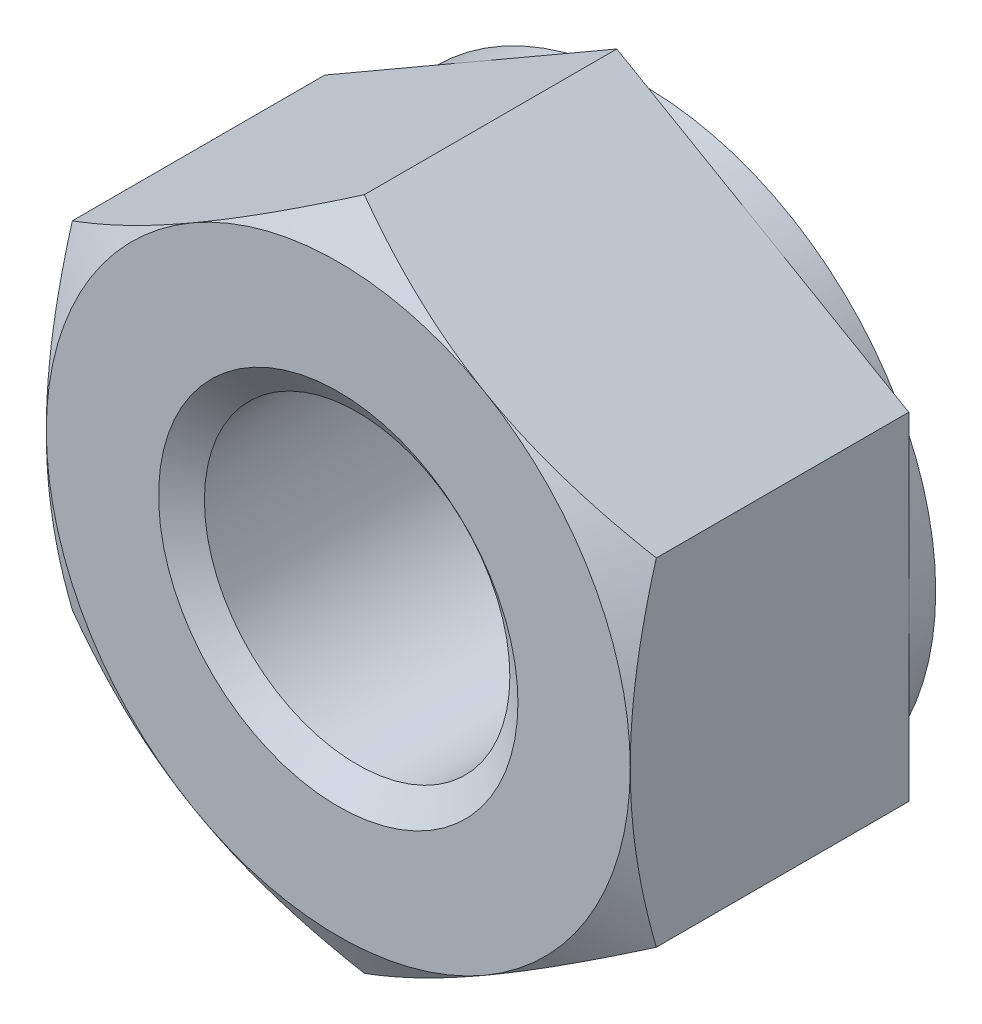
ISO-10303-21;
HEADER;
FILE_DESCRIPTION(('STEP AP214'),'2;1');
FILE_NAME('part.step','',(''),(''),'','','');
FILE_SCHEMA(('AUTOMOTIVE_DESIGN { 1 0 10303 214 1 1 1 1 }'));
ENDSEC;
DATA;
#1=APPLICATION_CONTEXT('core data for automotive mechanical design processes');
#2=APPLICATION_PROTOCOL_DEFINITION('international standard','automotive_design',2000,#1);
#3=PRODUCT_CONTEXT('',#1,'mechanical');
#4=PRODUCT('Part','Part','',(#3));
#5=PRODUCT_RELATED_PRODUCT_CATEGORY('part','',(#4));
#6=PRODUCT_DEFINITION_FORMATION('','',#4);
#7=PRODUCT_DEFINITION_CONTEXT('part definition',#1,'design');
#8=PRODUCT_DEFINITION('design','',#6,#7);
#9=PRODUCT_DEFINITION_SHAPE('','',#8);
#10=(LENGTH_UNIT() NAMED_UNIT(*) SI_UNIT(.MILLI.,.METRE.));
#11=(NAMED_UNIT(*) PLANE_ANGLE_UNIT() SI_UNIT($,.RADIAN.));
#12=(NAMED_UNIT(*) SI_UNIT($,.STERADIAN.) SOLID_ANGLE_UNIT());
#13=UNCERTAINTY_MEASURE_WITH_UNIT(LENGTH_MEASURE(1.E-05),#10,'distance_accuracy_value','');
#14=(GEOMETRIC_REPRESENTATION_CONTEXT(3) GLOBAL_UNCERTAINTY_ASSIGNED_CONTEXT((#13)) GLOBAL_UNIT_ASSIGNED_CONTEXT((#10,
#11,#12)) REPRESENTATION_CONTEXT('',''));
#15=CARTESIAN_POINT('',(0.,0.,0.));
#16=DIRECTION('',(0.,0.,1.));
#17=DIRECTION('',(1.,0.,0.));
#18=AXIS2_PLACEMENT_3D('',#15,#16,#17);
#19=CARTESIAN_POINT('',(0.,0.,-6.8));
#20=DIRECTION('',(0.,0.,1.));
#21=DIRECTION('',(1.,0.,0.));
#22=AXIS2_PLACEMENT_3D('',#19,#20,#21);
#23=CYLINDRICAL_SURFACE('',#22,3.4);
#24=CARTESIAN_POINT('',(0.,0.,-0.420124522925826));
#25=DIRECTION('',(0.,0.,1.));
#26=DIRECTION('',(1.,0.,0.));
#27=AXIS2_PLACEMENT_3D('',#24,#25,#26);
#28=CIRCLE('',#27,3.4);
#29=CARTESIAN_POINT('',(3.4,0.,-0.420124522925826));
#30=VERTEX_POINT('',#29);
#31=EDGE_CURVE('E158',#30,#30,#28,.F.);
#32=ORIENTED_EDGE('',*,*,#31,.F.);
#33=EDGE_LOOP('',(#32));
#34=FACE_BOUND('',#33,.T.);
#35=CARTESIAN_POINT('',(0.,0.,-6.35447547707417));
#36=DIRECTION('',(0.,0.,-1.));
#37=DIRECTION('',(-1.,0.,0.));
#38=AXIS2_PLACEMENT_3D('',#35,#36,#37);
#39=CIRCLE('',#38,3.4);
#40=CARTESIAN_POINT('',(-3.4,0.,-6.35447547707417));
#41=VERTEX_POINT('',#40);
#42=EDGE_CURVE('E46',#41,#41,#39,.F.);
#43=ORIENTED_EDGE('',*,*,#42,.F.);
#44=EDGE_LOOP('',(#43));
#45=FACE_BOUND('',#44,.T.);
#46=ADVANCED_FACE('F41',(#34,#45),#23,.F.);
#47=CARTESIAN_POINT('',(0.,7.50555349946514,-6.8));
#48=DIRECTION('',(-0.500000000000002,0.866025403784438,0.));
#49=DIRECTION('',(-0.866025403784438,-0.500000000000002,0.));
#50=AXIS2_PLACEMENT_3D('',#47,#48,#49);
#51=PLANE('',#50);
#52=DIRECTION('',(0.,0.,1.));
#53=VECTOR('',#52,1.);
#54=CARTESIAN_POINT('',(-6.5,3.75277674973256,-6.8));
#55=LINE('',#54,#53);
#56=CARTESIAN_POINT('',(-6.5,3.75277674973256,-6.2));
#57=VERTEX_POINT('',#56);
#58=CARTESIAN_POINT('',(-6.5,3.75277674973256,-0.580556583600771));
#59=VERTEX_POINT('',#58);
#60=EDGE_CURVE('E296',#57,#59,#55,.T.);
#61=ORIENTED_EDGE('',*,*,#60,.T.);
#62=CARTESIAN_POINT('',(-6.5002,3.75266127967872,-0.58062325180587));
#63=CARTESIAN_POINT('',(-6.35732254094112,3.8351516191275,-0.533004423075488));
#64=CARTESIAN_POINT('',(-6.21391236546509,3.91794952254312,-0.487546700602708));
#65=CARTESIAN_POINT('',(-5.9259273686828,4.08421773795794,-0.401548682023047));
#66=CARTESIAN_POINT('',(-5.78135207342874,4.16768832359105,-0.361010507228026));
#67=CARTESIAN_POINT('',(-5.34531134947997,4.41943655294051,-0.247571001123208));
#68=CARTESIAN_POINT('',(-5.05212471715368,4.58870793403689,-0.183047807128738));
#69=CARTESIAN_POINT('',(-4.61337625445563,4.84201947708215,-0.10738658354749));
#70=CARTESIAN_POINT('',(-4.46912536350531,4.92530276780316,-0.0858328564569865));
#71=CARTESIAN_POINT('',(-4.17997178286191,5.09224566542477,-0.049690314606118));
#72=CARTESIAN_POINT('',(-4.03506915190111,5.17590523841627,-0.0351008844596655));
#73=CARTESIAN_POINT('',(-3.74501222057168,5.34336968579964,-0.0132587525073459));
#74=CARTESIAN_POINT('',(-3.59985839394579,5.427174286676,-0.00599772432210719));
#75=CARTESIAN_POINT('',(-3.30942466302505,5.59485627940483,0.00103969741776889));
#76=CARTESIAN_POINT('',(-3.16414476276364,5.6787336689286,0.000816322187795537));
#77=CARTESIAN_POINT('',(-2.76612405757351,5.90853103021317,-0.0100834585151655));
#78=CARTESIAN_POINT('',(-2.51351353897243,6.05437578112764,-0.028381817869414));
#79=CARTESIAN_POINT('',(-2.00997032176432,6.34509659313135,-0.0864063414576771));
#80=CARTESIAN_POINT('',(-1.75903939406692,6.48997163178545,-0.126152338538247));
#81=CARTESIAN_POINT('',(-1.25448277935568,6.78127752911039,-0.225505903202153));
#82=CARTESIAN_POINT('',(-1.00092075856409,6.92767163007068,-0.285534425638031));
#83=CARTESIAN_POINT('',(-0.497578064240956,7.21827667013277,-0.421774992509875));
#84=CARTESIAN_POINT('',(-0.247790944447037,7.36249133098589,-0.497955034163601));
#85=CARTESIAN_POINT('',(0.000199999999999077,7.50566896951898,-0.580623251805876));
#86=B_SPLINE_CURVE_WITH_KNOTS('',3,(#62,#63,#64,#65,#66,#67,#68,#69,#70,#71,#72,#73,#74,#75,#76,
#77,#78,#79,#80,#81,#82,#83,#84,#85),.UNSPECIFIED.,.F.,.F.,(4,2,2,2,2,2,2,2,2,2,2,4),(0.,
0.515105052395588,1.03043143507525,2.06322554824263,2.56697389547997,3.07067772176454,
3.57380860368928,4.0769239424252,4.95279354705661,5.82947446853467,6.72559912449737,
7.61996451221047),.UNSPECIFIED.);
#87=CARTESIAN_POINT('',(-3.25000000000001,5.62916512459885,0.));
#88=VERTEX_POINT('',#87);
#89=EDGE_CURVE('E144',#59,#88,#86,.T.);
#90=ORIENTED_EDGE('',*,*,#89,.T.);
#91=CARTESIAN_POINT('',(0.,7.50555349946514,-0.580556583600771));
#92=VERTEX_POINT('',#91);
#93=EDGE_CURVE('E171',#88,#92,#86,.T.);
#94=ORIENTED_EDGE('',*,*,#93,.T.);
#95=DIRECTION('',(0.,0.,1.));
#96=VECTOR('',#95,1.);
#97=CARTESIAN_POINT('',(0.,7.50555349946514,-6.8));
#98=LINE('',#97,#96);
#99=CARTESIAN_POINT('',(0.,7.50555349946514,-6.2));
#100=VERTEX_POINT('',#99);
#101=EDGE_CURVE('E284',#100,#92,#98,.T.);
#102=ORIENTED_EDGE('',*,*,#101,.F.);
#103=DIRECTION('',(-0.866025403784438,-0.500000000000002,0.));
#104=VECTOR('',#103,1.);
#105=CARTESIAN_POINT('',(0.,7.50555349946514,-6.2));
#106=LINE('',#105,#104);
#107=CARTESIAN_POINT('',(-3.25000000000001,5.62916512459885,-6.2));
#108=VERTEX_POINT('',#107);
#109=EDGE_CURVE('E272',#100,#108,#106,.T.);
#110=ORIENTED_EDGE('',*,*,#109,.T.);
#111=EDGE_CURVE('E268',#108,#57,#106,.T.);
#112=ORIENTED_EDGE('',*,*,#111,.T.);
#113=EDGE_LOOP('',(#61,#90,#94,#102,#110,#112));
#114=FACE_BOUND('',#113,.T.);
#115=ADVANCED_FACE('F43',(#114),#51,.T.);
#116=CARTESIAN_POINT('',(6.5,3.75277674973256,-6.8));
#117=DIRECTION('',(0.500000000000001,0.866025403784438,0.));
#118=DIRECTION('',(-0.866025403784438,0.500000000000001,0.));
#119=AXIS2_PLACEMENT_3D('',#116,#117,#118);
#120=PLANE('',#119);
#121=ORIENTED_EDGE('',*,*,#101,.T.);
#122=CARTESIAN_POINT('',(-0.000200000000000769,7.50566896951898,-0.580623251805876));
#123=CARTESIAN_POINT('',(0.14267745905888,7.4231786300702,-0.533004423075494));
#124=CARTESIAN_POINT('',(0.286087634534912,7.34038072665459,-0.487546700602714));
#125=CARTESIAN_POINT('',(0.574072631317195,7.17411251123976,-0.401548682023053));
#126=CARTESIAN_POINT('',(0.718647926571264,7.09064192560666,-0.361010507228032));
#127=CARTESIAN_POINT('',(1.15468865052003,6.83889369625719,-0.247571001123213));
#128=CARTESIAN_POINT('',(1.44787528284632,6.66962231516081,-0.183047807128742));
#129=CARTESIAN_POINT('',(1.88662374554438,6.41631077211555,-0.107386583547494));
#130=CARTESIAN_POINT('',(2.03087463649469,6.33302748139454,-0.0858328564569894));
#131=CARTESIAN_POINT('',(2.32002821713809,6.16608458377293,-0.0496903146061202));
#132=CARTESIAN_POINT('',(2.46493084809889,6.08242501078143,-0.0351008844596673));
#133=CARTESIAN_POINT('',(2.75498777942832,5.91496056339806,-0.0132587525073472));
#134=CARTESIAN_POINT('',(2.90014160605421,5.8311559625217,-0.00599772432210828));
#135=CARTESIAN_POINT('',(3.19057533697495,5.66347396979287,0.00103969741776823));
#136=CARTESIAN_POINT('',(3.33585523723636,5.5795965802691,0.000816322187795168));
#137=CARTESIAN_POINT('',(3.7338759424265,5.34979921898453,-0.0100834585151652));
#138=CARTESIAN_POINT('',(3.98648646102757,5.20395446807007,-0.0283818178694134));
#139=CARTESIAN_POINT('',(4.49002967823568,4.91323365606635,-0.0864063414576753));
#140=CARTESIAN_POINT('',(4.74096060593308,4.76835861741225,-0.126152338538245));
#141=CARTESIAN_POINT('',(5.24551722064432,4.47705272008731,-0.22550590320215));
#142=CARTESIAN_POINT('',(5.49907924143591,4.33065861912702,-0.285534425638027));
#143=CARTESIAN_POINT('',(6.00242193575904,4.04005357906493,-0.42177499250987));
#144=CARTESIAN_POINT('',(6.25220905555296,3.89583891821181,-0.497955034163595));
#145=CARTESIAN_POINT('',(6.5002,3.75266127967872,-0.58062325180587));
#146=B_SPLINE_CURVE_WITH_KNOTS('',3,(#122,#123,#124,#125,#126,#127,#128,#129,#130,#131,#132,
#133,#134,#135,#136,#137,#138,#139,#140,#141,#142,#143,#144,#145),.UNSPECIFIED.,.F.,.F.,(4,2,2,
2,2,2,2,2,2,2,2,4),(0.,0.515105052395589,1.03043143507525,2.06322554824263,2.56697389547997,
3.07067772176454,3.57380860368929,4.07692394242521,4.95279354705661,5.82947446853467,
6.72559912449737,7.61996451221046),.UNSPECIFIED.);
#147=CARTESIAN_POINT('',(3.25000000000001,5.62916512459885,0.));
#148=VERTEX_POINT('',#147);
#149=EDGE_CURVE('E167',#92,#148,#146,.T.);
#150=ORIENTED_EDGE('',*,*,#149,.T.);
#151=CARTESIAN_POINT('',(6.5,3.75277674973258,-0.580556583600771));
#152=VERTEX_POINT('',#151);
#153=EDGE_CURVE('E153',#148,#152,#146,.T.);
#154=ORIENTED_EDGE('',*,*,#153,.T.);
#155=DIRECTION('',(0.,0.,1.));
#156=VECTOR('',#155,1.);
#157=CARTESIAN_POINT('',(6.5,3.75277674973256,-6.8));
#158=LINE('',#157,#156);
#159=CARTESIAN_POINT('',(6.5,3.75277674973256,-6.2));
#160=VERTEX_POINT('',#159);
#161=EDGE_CURVE('E166',#160,#152,#158,.T.);
#162=ORIENTED_EDGE('',*,*,#161,.F.);
#163=DIRECTION('',(-0.866025403784438,0.500000000000001,0.));
#164=VECTOR('',#163,1.);
#165=CARTESIAN_POINT('',(6.5,3.75277674973256,-6.2));
#166=LINE('',#165,#164);
#167=CARTESIAN_POINT('',(3.25000000000001,5.62916512459885,-6.2));
#168=VERTEX_POINT('',#167);
#169=EDGE_CURVE('E280',#160,#168,#166,.T.);
#170=ORIENTED_EDGE('',*,*,#169,.T.);
#171=EDGE_CURVE('E276',#168,#100,#166,.T.);
#172=ORIENTED_EDGE('',*,*,#171,.T.);
#173=EDGE_LOOP('',(#121,#150,#154,#162,#170,#172));
#174=FACE_BOUND('',#173,.T.);
#175=ADVANCED_FACE('F243',(#174),#120,.T.);
#176=CARTESIAN_POINT('',(6.5,3.75277674973256,-6.8));
#177=DIRECTION('',(-1.,0.,0.));
#178=DIRECTION('',(0.,0.,1.));
#179=AXIS2_PLACEMENT_3D('',#176,#177,#178);
#180=PLANE('',#179);
#181=CARTESIAN_POINT('',(6.5,-9.95291698368313,-3.11042358451599));
#182=CARTESIAN_POINT('',(6.5,-9.66753022820206,-2.97250893962365));
#183=CARTESIAN_POINT('',(6.5,-9.38146872221018,-2.8359652810007));
#184=CARTESIAN_POINT('',(6.5,-8.80763137697965,-2.56640336373165));
#185=CARTESIAN_POINT('',(6.5,-8.5198552513496,-2.43338571546935));
#186=CARTESIAN_POINT('',(6.5,-7.94066929123456,-2.17095850209535));
#187=CARTESIAN_POINT('',(6.5,-7.64924808662455,-2.04157394066247));
#188=CARTESIAN_POINT('',(6.5,-7.06401043497073,-1.78836220262284));
#189=CARTESIAN_POINT('',(6.5,-6.77019411372555,-1.66453473633514));
#190=CARTESIAN_POINT('',(6.5,-6.17605150217578,-1.42244480194622));
#191=CARTESIAN_POINT('',(6.5,-5.87568957429354,-1.30426931829828));
#192=CARTESIAN_POINT('',(6.5,-5.27142269448723,-1.07717389386354));
#193=CARTESIAN_POINT('',(6.5,-4.9675173526422,-0.968254982821991));
#194=CARTESIAN_POINT('',(6.5,-4.35630541725461,-0.762599022073944));
#195=CARTESIAN_POINT('',(6.5,-4.04900762614674,-0.665836073792646));
#196=CARTESIAN_POINT('',(6.5,-3.43004022230997,-0.487635712034288));
#197=CARTESIAN_POINT('',(6.5,-3.11837202573309,-0.406193452076782));
#198=CARTESIAN_POINT('',(6.5,-2.49046594828965,-0.26258408019258));
#199=CARTESIAN_POINT('',(6.5,-2.17422687409775,-0.200422100523436));
#200=CARTESIAN_POINT('',(6.5,-1.5378916759482,-0.0995742225329257));
#201=CARTESIAN_POINT('',(6.5,-1.2177955485807,-0.0608883449673841));
#202=CARTESIAN_POINT('',(6.5,-0.737141963129278,-0.0229465620569957));
#203=CARTESIAN_POINT('',(6.5,-0.57733688697972,-0.0136452147630797));
#204=CARTESIAN_POINT('',(6.5,-0.257468906786595,-0.00181408796460789));
#205=CARTESIAN_POINT('',(6.5,-0.0974060061182582,0.000715779477276867));
#206=CARTESIAN_POINT('',(6.5,0.222635442153785,-0.00106401163083596));
#207=CARTESIAN_POINT('',(6.5,0.382614000823772,-0.00537175068700523));
#208=CARTESIAN_POINT('',(6.5,0.702250634961164,-0.020717582519642));
#209=CARTESIAN_POINT('',(6.5,0.861908694024545,-0.0317560114013201));
#210=CARTESIAN_POINT('',(6.5,1.24887053403167,-0.0664368683339286));
#211=CARTESIAN_POINT('',(6.5,1.47587694728923,-0.093451878593183));
#212=CARTESIAN_POINT('',(6.5,1.92815030612898,-0.15958988800503));
#213=CARTESIAN_POINT('',(6.5,2.15341675970355,-0.198716192016403));
#214=CARTESIAN_POINT('',(6.5,2.6020242784339,-0.287689170365798));
#215=CARTESIAN_POINT('',(6.5,2.82536331401075,-0.337545980881486));
#216=CARTESIAN_POINT('',(6.5,3.26974354822384,-0.446458764113079));
#217=CARTESIAN_POINT('',(6.5,3.49078496123694,-0.505513870223688));
#218=CARTESIAN_POINT('',(6.5,3.93601414582635,-0.632954116493084));
#219=CARTESIAN_POINT('',(6.5,4.1601462295919,-0.701532472923335));
#220=CARTESIAN_POINT('',(6.5,4.60604131565917,-0.845465123541097));
#221=CARTESIAN_POINT('',(6.5,4.82780583559526,-0.920814744092753));
#222=CARTESIAN_POINT('',(6.5,5.26807593346454,-1.07673350293345));
#223=CARTESIAN_POINT('',(6.5,5.4865928289811,-1.15727087504746));
#224=CARTESIAN_POINT('',(6.5,5.92193123194619,-1.32307270438627));
#225=CARTESIAN_POINT('',(6.5,6.13875201319725,-1.40833907213759));
#226=CARTESIAN_POINT('',(6.5,6.35478510853348,-1.49550213563036));
#227=B_SPLINE_CURVE_WITH_KNOTS('',3,(#181,#182,#183,#184,#185,#186,#187,#188,#189,#190,#191,
#192,#193,#194,#195,#196,#197,#198,#199,#200,#201,#202,#203,#204,#205,#206,#207,#208,#209,#210,
#211,#212,#213,#214,#215,#216,#217,#218,#219,#220,#221,#222,#223,#224,#225,#226),.UNSPECIFIED.,
.F.,.F.,(4,2,2,2,2,2,2,2,2,2,2,2,2,2,2,2,2,2,2,2,2,2,4),(0.,0.950904162864941,1.90197187472378,
2.85848216299727,3.81494253212838,4.78314526620908,5.75145556717361,6.71766655133576,
7.68357137261129,8.64973308985235,9.61589566130056,10.0960003863608,10.5760988765458,
11.0560626144432,11.5360503218788,12.2214931749033,12.9071232326805,13.5934038106301,
14.2796197706252,14.9826563668411,15.6852113891479,16.3838119598016,17.082696852468),.UNSPECIFIED.);
#228=CARTESIAN_POINT('',(6.5,-3.75277674973258,-0.580556583600771));
#229=VERTEX_POINT('',#228);
#230=CARTESIAN_POINT('',(6.5,0.,0.));
#231=VERTEX_POINT('',#230);
#232=EDGE_CURVE('E133',#229,#231,#227,.T.);
#233=ORIENTED_EDGE('',*,*,#232,.F.);
#234=DIRECTION('',(0.,0.,1.));
#235=VECTOR('',#234,1.);
#236=CARTESIAN_POINT('',(6.5,-3.75277674973258,-6.8));
#237=LINE('',#236,#235);
#238=CARTESIAN_POINT('',(6.5,-3.75277674973258,-6.2));
#239=VERTEX_POINT('',#238);
#240=EDGE_CURVE('E289',#239,#229,#237,.T.);
#241=ORIENTED_EDGE('',*,*,#240,.F.);
#242=DIRECTION('',(0.,-1.,0.));
#243=VECTOR('',#242,1.);
#244=CARTESIAN_POINT('',(6.5,3.75277674973256,-6.2));
#245=LINE('',#244,#243);
#246=CARTESIAN_POINT('',(6.5,0.,-6.2));
#247=VERTEX_POINT('',#246);
#248=EDGE_CURVE('E281',#247,#239,#245,.T.);
#249=ORIENTED_EDGE('',*,*,#248,.F.);
#250=EDGE_CURVE('E283',#160,#247,#245,.T.);
#251=ORIENTED_EDGE('',*,*,#250,.F.);
#252=ORIENTED_EDGE('',*,*,#161,.T.);
#253=EDGE_CURVE('E146',#231,#152,#227,.T.);
#254=ORIENTED_EDGE('',*,*,#253,.F.);
#255=EDGE_LOOP('',(#233,#241,#249,#251,#252,#254));
#256=FACE_BOUND('',#255,.T.);
#257=ADVANCED_FACE('F163',(#256),#180,.F.);
#258=CARTESIAN_POINT('',(0.,-7.50555349946516,-6.8));
#259=DIRECTION('',(0.500000000000002,-0.866025403784437,0.));
#260=DIRECTION('',(0.866025403784438,0.500000000000002,0.));
#261=AXIS2_PLACEMENT_3D('',#258,#259,#260);
#262=PLANE('',#261);
#263=ORIENTED_EDGE('',*,*,#240,.T.);
#264=CARTESIAN_POINT('',(6.5002,-3.75266127967874,-0.580623251805876));
#265=CARTESIAN_POINT('',(6.35732254094112,-3.83515161912752,-0.533004423075494));
#266=CARTESIAN_POINT('',(6.21391236546509,-3.91794952254314,-0.487546700602714));
#267=CARTESIAN_POINT('',(5.9259273686828,-4.08421773795796,-0.401548682023053));
#268=CARTESIAN_POINT('',(5.78135207342874,-4.16768832359107,-0.361010507228032));
#269=CARTESIAN_POINT('',(5.34531134947996,-4.41943655294053,-0.247571001123215));
#270=CARTESIAN_POINT('',(5.05212471715368,-4.58870793403691,-0.183047807128746));
#271=CARTESIAN_POINT('',(4.61337625445562,-4.84201947708217,-0.107386583547499));
#272=CARTESIAN_POINT('',(4.46912536350531,-4.92530276780318,-0.0858328564569949));
#273=CARTESIAN_POINT('',(4.17997178286191,-5.09224566542479,-0.0496903146061268));
#274=CARTESIAN_POINT('',(4.03506915190111,-5.17590523841629,-0.0351008844596745));
#275=CARTESIAN_POINT('',(3.74501222057168,-5.34336968579966,-0.0132587525073552));
#276=CARTESIAN_POINT('',(3.59985839394579,-5.42717428667602,-0.00599772432211649));
#277=CARTESIAN_POINT('',(3.30942466302505,-5.59485627940486,0.00103969741775916));
#278=CARTESIAN_POINT('',(3.16414476276364,-5.67873366892862,0.00081632218778539));
#279=CARTESIAN_POINT('',(2.7661240575735,-5.9085310302132,-0.0100834585151767));
#280=CARTESIAN_POINT('',(2.51351353897243,-6.05437578112766,-0.0283818178694256));
#281=CARTESIAN_POINT('',(2.00997032176432,-6.34509659313137,-0.0864063414576891));
#282=CARTESIAN_POINT('',(1.75903939406691,-6.48997163178547,-0.126152338538259));
#283=CARTESIAN_POINT('',(1.25448277935568,-6.78127752911041,-0.225505903202166));
#284=CARTESIAN_POINT('',(1.00092075856408,-6.9276716300707,-0.285534425638044));
#285=CARTESIAN_POINT('',(0.497578064240955,-7.21827667013279,-0.421774992509888));
#286=CARTESIAN_POINT('',(0.247790944447037,-7.36249133098592,-0.497955034163613));
#287=CARTESIAN_POINT('',(-0.000199999999998837,-7.505668969519,-0.580623251805888));
#288=B_SPLINE_CURVE_WITH_KNOTS('',3,(#264,#265,#266,#267,#268,#269,#270,#271,#272,#273,#274,
#275,#276,#277,#278,#279,#280,#281,#282,#283,#284,#285,#286,#287),.UNSPECIFIED.,.F.,.F.,(4,2,2,
2,2,2,2,2,2,2,2,4),(0.,0.515105052395588,1.03043143507525,2.06322554824263,2.56697389547997,
3.07067772176454,3.57380860368929,4.07692394242521,4.95279354705661,5.82947446853467,
6.72559912449737,7.61996451221047),.UNSPECIFIED.);
#289=CARTESIAN_POINT('',(3.25000000000001,-5.62916512459885,0.));
#290=VERTEX_POINT('',#289);
#291=EDGE_CURVE('E139',#229,#290,#288,.T.);
#292=ORIENTED_EDGE('',*,*,#291,.T.);
#293=CARTESIAN_POINT('',(0.,-7.50555349946514,-0.580556583600771));
#294=VERTEX_POINT('',#293);
#295=EDGE_CURVE('E60',#290,#294,#288,.T.);
#296=ORIENTED_EDGE('',*,*,#295,.T.);
#297=DIRECTION('',(0.,0.,1.));
#298=VECTOR('',#297,1.);
#299=CARTESIAN_POINT('',(0.,-7.50555349946516,-6.8));
#300=LINE('',#299,#298);
#301=CARTESIAN_POINT('',(0.,-7.50555349946516,-6.2));
#302=VERTEX_POINT('',#301);
#303=EDGE_CURVE('E291',#302,#294,#300,.T.);
#304=ORIENTED_EDGE('',*,*,#303,.F.);
#305=DIRECTION('',(0.866025403784438,0.500000000000002,0.));
#306=VECTOR('',#305,1.);
#307=CARTESIAN_POINT('',(0.,-7.50555349946516,-6.2));
#308=LINE('',#307,#306);
#309=CARTESIAN_POINT('',(3.25000000000002,-5.62916512459886,-6.2));
#310=VERTEX_POINT('',#309);
#311=EDGE_CURVE('E273',#302,#310,#308,.T.);
#312=ORIENTED_EDGE('',*,*,#311,.T.);
#313=EDGE_CURVE('E277',#310,#239,#308,.T.);
#314=ORIENTED_EDGE('',*,*,#313,.T.);
#315=EDGE_LOOP('',(#263,#292,#296,#304,#312,#314));
#316=FACE_BOUND('',#315,.T.);
#317=ADVANCED_FACE('F224',(#316),#262,.T.);
#318=CARTESIAN_POINT('',(-6.5,-3.75277674973258,-6.8));
#319=DIRECTION('',(-0.500000000000001,-0.866025403784438,0.));
#320=DIRECTION('',(0.866025403784438,-0.500000000000001,0.));
#321=AXIS2_PLACEMENT_3D('',#318,#319,#320);
#322=PLANE('',#321);
#323=ORIENTED_EDGE('',*,*,#303,.T.);
#324=CARTESIAN_POINT('',(0.000200000000000905,-7.505668969519,-0.580623251805889));
#325=CARTESIAN_POINT('',(-0.14267745905888,-7.42317863007023,-0.533004423075506));
#326=CARTESIAN_POINT('',(-0.286087634534914,-7.34038072665461,-0.487546700602727));
#327=CARTESIAN_POINT('',(-0.574072631317197,-7.17411251123978,-0.401548682023064));
#328=CARTESIAN_POINT('',(-0.718647926571266,-7.09064192560667,-0.361010507228043));
#329=CARTESIAN_POINT('',(-1.15468865052004,-6.83889369625721,-0.247571001123224));
#330=CARTESIAN_POINT('',(-1.44787528284632,-6.66962231516083,-0.183047807128753));
#331=CARTESIAN_POINT('',(-1.88662374554438,-6.41631077211557,-0.107386583547504));
#332=CARTESIAN_POINT('',(-2.0308746364947,-6.33302748139456,-0.0858328564569998));
#333=CARTESIAN_POINT('',(-2.3200282171381,-6.16608458377295,-0.0496903146061308));
#334=CARTESIAN_POINT('',(-2.4649308480989,-6.08242501078145,-0.0351008844596783));
#335=CARTESIAN_POINT('',(-2.75498777942833,-5.91496056339808,-0.0132587525073582));
#336=CARTESIAN_POINT('',(-2.90014160605422,-5.83115596252172,-0.00599772432211898));
#337=CARTESIAN_POINT('',(-3.19057533697496,-5.66347396979288,0.00103969741775764));
#338=CARTESIAN_POINT('',(-3.33585523723637,-5.57959658026912,0.000816322187784388));
#339=CARTESIAN_POINT('',(-3.73387594242651,-5.34979921898455,-0.0100834585151759));
#340=CARTESIAN_POINT('',(-3.98648646102758,-5.20395446807008,-0.0283818178694233));
#341=CARTESIAN_POINT('',(-4.49002967823569,-4.91323365606637,-0.0864063414576845));
#342=CARTESIAN_POINT('',(-4.74096060593309,-4.76835861741227,-0.126152338538254));
#343=CARTESIAN_POINT('',(-5.24551722064433,-4.47705272008733,-0.225505903202159));
#344=CARTESIAN_POINT('',(-5.49907924143592,-4.33065861912704,-0.285534425638036));
#345=CARTESIAN_POINT('',(-6.00242193575905,-4.04005357906495,-0.421774992509877));
#346=CARTESIAN_POINT('',(-6.25220905555296,-3.89583891821183,-0.497955034163602));
#347=CARTESIAN_POINT('',(-6.5002,-3.75266127967875,-0.580623251805876));
#348=B_SPLINE_CURVE_WITH_KNOTS('',3,(#324,#325,#326,#327,#328,#329,#330,#331,#332,#333,#334,
#335,#336,#337,#338,#339,#340,#341,#342,#343,#344,#345,#346,#347),.UNSPECIFIED.,.F.,.F.,(4,2,2,
2,2,2,2,2,2,2,2,4),(0.,0.515105052395591,1.03043143507525,2.06322554824263,2.56697389547998,
3.07067772176455,3.5738086036893,4.07692394242522,4.95279354705662,5.82947446853468,
6.72559912449737,7.61996451221046),.UNSPECIFIED.);
#349=CARTESIAN_POINT('',(-3.25000000000001,-5.62916512459885,0.));
#350=VERTEX_POINT('',#349);
#351=EDGE_CURVE('E218',#294,#350,#348,.T.);
#352=ORIENTED_EDGE('',*,*,#351,.T.);
#353=CARTESIAN_POINT('',(-6.5,-3.75277674973258,-0.580556583600771));
#354=VERTEX_POINT('',#353);
#355=EDGE_CURVE('E67',#350,#354,#348,.T.);
#356=ORIENTED_EDGE('',*,*,#355,.T.);
#357=DIRECTION('',(0.,0.,1.));
#358=VECTOR('',#357,1.);
#359=CARTESIAN_POINT('',(-6.5,-3.75277674973258,-6.8));
#360=LINE('',#359,#358);
#361=CARTESIAN_POINT('',(-6.5,-3.75277674973258,-6.2));
#362=VERTEX_POINT('',#361);
#363=EDGE_CURVE('E294',#362,#354,#360,.T.);
#364=ORIENTED_EDGE('',*,*,#363,.F.);
#365=DIRECTION('',(0.866025403784438,-0.500000000000001,0.));
#366=VECTOR('',#365,1.);
#367=CARTESIAN_POINT('',(-6.5,-3.75277674973258,-6.2));
#368=LINE('',#367,#366);
#369=CARTESIAN_POINT('',(-3.25000000000002,-5.62916512459886,-6.2));
#370=VERTEX_POINT('',#369);
#371=EDGE_CURVE('E263',#362,#370,#368,.T.);
#372=ORIENTED_EDGE('',*,*,#371,.T.);
#373=EDGE_CURVE('E269',#370,#302,#368,.T.);
#374=ORIENTED_EDGE('',*,*,#373,.T.);
#375=EDGE_LOOP('',(#323,#352,#356,#364,#372,#374));
#376=FACE_BOUND('',#375,.T.);
#377=ADVANCED_FACE('F220',(#376),#322,.T.);
#378=CARTESIAN_POINT('',(-6.5,3.75277674973256,-6.8));
#379=DIRECTION('',(-1.,0.,0.));
#380=DIRECTION('',(0.,0.,1.));
#381=AXIS2_PLACEMENT_3D('',#378,#379,#380);
#382=PLANE('',#381);
#383=ORIENTED_EDGE('',*,*,#363,.T.);
#384=CARTESIAN_POINT('',(-6.5,-9.95291698368314,-3.110423584516));
#385=CARTESIAN_POINT('',(-6.5,-9.66753022820206,-2.97250893962365));
#386=CARTESIAN_POINT('',(-6.5,-9.38146872221019,-2.8359652810007));
#387=CARTESIAN_POINT('',(-6.5,-8.80763137697965,-2.56640336373166));
#388=CARTESIAN_POINT('',(-6.5,-8.5198552513496,-2.43338571546936));
#389=CARTESIAN_POINT('',(-6.5,-7.94066929123456,-2.17095850209535));
#390=CARTESIAN_POINT('',(-6.5,-7.64924808662455,-2.04157394066247));
#391=CARTESIAN_POINT('',(-6.5,-7.06401043497073,-1.78836220262284));
#392=CARTESIAN_POINT('',(-6.5,-6.77019411372555,-1.66453473633514));
#393=CARTESIAN_POINT('',(-6.5,-6.17605150217578,-1.42244480194622));
#394=CARTESIAN_POINT('',(-6.5,-5.87568957429354,-1.30426931829828));
#395=CARTESIAN_POINT('',(-6.5,-5.27142269448723,-1.07717389386354));
#396=CARTESIAN_POINT('',(-6.5,-4.9675173526422,-0.968254982821992));
#397=CARTESIAN_POINT('',(-6.5,-4.35630541725462,-0.762599022073945));
#398=CARTESIAN_POINT('',(-6.5,-4.04900762614674,-0.665836073792646));
#399=CARTESIAN_POINT('',(-6.5,-3.43004022230997,-0.487635712034289));
#400=CARTESIAN_POINT('',(-6.5,-3.11837202573309,-0.406193452076783));
#401=CARTESIAN_POINT('',(-6.5,-2.49046594828965,-0.262584080192581));
#402=CARTESIAN_POINT('',(-6.5,-2.17422687409775,-0.200422100523437));
#403=CARTESIAN_POINT('',(-6.5,-1.53789167594821,-0.099574222532926));
#404=CARTESIAN_POINT('',(-6.5,-1.2177955485807,-0.0608883449673841));
#405=CARTESIAN_POINT('',(-6.5,-0.737141963129281,-0.0229465620569956));
#406=CARTESIAN_POINT('',(-6.5,-0.577336886979722,-0.0136452147630797));
#407=CARTESIAN_POINT('',(-6.5,-0.257468906786597,-0.0018140879646079));
#408=CARTESIAN_POINT('',(-6.5,-0.09740600611826,0.000715779477276867));
#409=CARTESIAN_POINT('',(-6.5,0.222635442153783,-0.00106401163083596));
#410=CARTESIAN_POINT('',(-6.5,0.382614000823771,-0.00537175068700523));
#411=CARTESIAN_POINT('',(-6.5,0.702250634961162,-0.020717582519642));
#412=CARTESIAN_POINT('',(-6.5,0.861908694024543,-0.0317560114013201));
#413=CARTESIAN_POINT('',(-6.5,1.24887053403166,-0.0664368683339287));
#414=CARTESIAN_POINT('',(-6.5,1.47587694728923,-0.0934518785931832));
#415=CARTESIAN_POINT('',(-6.5,1.92815030612897,-0.15958988800503));
#416=CARTESIAN_POINT('',(-6.5,2.15341675970355,-0.198716192016402));
#417=CARTESIAN_POINT('',(-6.5,2.60202427843389,-0.287689170365797));
#418=CARTESIAN_POINT('',(-6.5,2.82536331401075,-0.337545980881485));
#419=CARTESIAN_POINT('',(-6.5,3.26974354822384,-0.446458764113078));
#420=CARTESIAN_POINT('',(-6.5,3.49078496123693,-0.505513870223687));
#421=CARTESIAN_POINT('',(-6.5,3.93601414582635,-0.632954116493083));
#422=CARTESIAN_POINT('',(-6.5,4.16014622959189,-0.701532472923334));
#423=CARTESIAN_POINT('',(-6.5,4.60604131565917,-0.845465123541095));
#424=CARTESIAN_POINT('',(-6.5,4.82780583559525,-0.92081474409275));
#425=CARTESIAN_POINT('',(-6.5,5.26807593346453,-1.07673350293344));
#426=CARTESIAN_POINT('',(-6.5,5.48659282898109,-1.15727087504746));
#427=CARTESIAN_POINT('',(-6.5,5.92193123194618,-1.32307270438627));
#428=CARTESIAN_POINT('',(-6.5,6.13875201319725,-1.40833907213758));
#429=CARTESIAN_POINT('',(-6.5,6.35478510853347,-1.49550213563036));
#430=B_SPLINE_CURVE_WITH_KNOTS('',3,(#384,#385,#386,#387,#388,#389,#390,#391,#392,#393,#394,
#395,#396,#397,#398,#399,#400,#401,#402,#403,#404,#405,#406,#407,#408,#409,#410,#411,#412,#413,
#414,#415,#416,#417,#418,#419,#420,#421,#422,#423,#424,#425,#426,#427,#428,#429),.UNSPECIFIED.,
.F.,.F.,(4,2,2,2,2,2,2,2,2,2,2,2,2,2,2,2,2,2,2,2,2,2,4),(0.,0.950904162864942,1.90197187472378,
2.85848216299728,3.81494253212838,4.78314526620908,5.75145556717362,6.71766655133577,
7.6835713726113,8.64973308985235,9.61589566130056,10.0960003863608,10.5760988765458,
11.0560626144432,11.5360503218788,12.2214931749033,12.9071232326805,13.5934038106301,
14.2796197706252,14.9826563668411,15.6852113891479,16.3838119598016,17.082696852468),.UNSPECIFIED.);
#431=CARTESIAN_POINT('',(-6.5,0.,0.));
#432=VERTEX_POINT('',#431);
#433=EDGE_CURVE('E219',#354,#432,#430,.T.);
#434=ORIENTED_EDGE('',*,*,#433,.T.);
#435=EDGE_CURVE('E157',#432,#59,#430,.T.);
#436=ORIENTED_EDGE('',*,*,#435,.T.);
#437=ORIENTED_EDGE('',*,*,#60,.F.);
#438=DIRECTION('',(0.,-1.,0.));
#439=VECTOR('',#438,1.);
#440=CARTESIAN_POINT('',(-6.5,3.75277674973256,-6.2));
#441=LINE('',#440,#439);
#442=CARTESIAN_POINT('',(-6.5,0.,-6.2));
#443=VERTEX_POINT('',#442);
#444=EDGE_CURVE('E303',#57,#443,#441,.T.);
#445=ORIENTED_EDGE('',*,*,#444,.T.);
#446=EDGE_CURVE('E301',#443,#362,#441,.T.);
#447=ORIENTED_EDGE('',*,*,#446,.T.);
#448=EDGE_LOOP('',(#383,#434,#436,#437,#445,#447));
#449=FACE_BOUND('',#448,.T.);
#450=ADVANCED_FACE('F223',(#449),#382,.T.);
#451=CARTESIAN_POINT('',(-13.,0.,0.));
#452=DIRECTION('',(0.,0.,1.));
#453=DIRECTION('',(1.,0.,0.));
#454=AXIS2_PLACEMENT_3D('',#451,#452,#453);
#455=PLANE('',#454);
#456=CARTESIAN_POINT('',(0.,0.,0.));
#457=DIRECTION('',(0.,0.,1.));
#458=DIRECTION('',(1.,0.,0.));
#459=AXIS2_PLACEMENT_3D('',#456,#457,#458);
#460=CIRCLE('',#459,4.);
#461=CARTESIAN_POINT('',(4.,0.,0.));
#462=VERTEX_POINT('',#461);
#463=EDGE_CURVE('E306',#462,#462,#460,.T.);
#464=ORIENTED_EDGE('',*,*,#463,.F.);
#465=EDGE_LOOP('',(#464));
#466=FACE_BOUND('',#465,.T.);
#467=CARTESIAN_POINT('',(0.,0.,0.));
#468=DIRECTION('',(0.,0.,1.));
#469=DIRECTION('',(1.,0.,0.));
#470=AXIS2_PLACEMENT_3D('',#467,#468,#469);
#471=CIRCLE('',#470,6.5);
#472=EDGE_CURVE('E12',#231,#290,#471,.F.);
#473=ORIENTED_EDGE('',*,*,#472,.F.);
#474=CARTESIAN_POINT('',(0.,0.,0.));
#475=DIRECTION('',(0.,0.,1.));
#476=DIRECTION('',(1.,0.,0.));
#477=AXIS2_PLACEMENT_3D('',#474,#475,#476);
#478=CIRCLE('',#477,6.5);
#479=EDGE_CURVE('E150',#231,#148,#478,.T.);
#480=ORIENTED_EDGE('',*,*,#479,.T.);
#481=EDGE_CURVE('E53',#88,#148,#471,.F.);
#482=ORIENTED_EDGE('',*,*,#481,.F.);
#483=EDGE_CURVE('E371',#432,#88,#471,.F.);
#484=ORIENTED_EDGE('',*,*,#483,.F.);
#485=EDGE_CURVE('E373',#350,#432,#471,.F.);
#486=ORIENTED_EDGE('',*,*,#485,.F.);
#487=EDGE_CURVE('E51',#290,#350,#471,.F.);
#488=ORIENTED_EDGE('',*,*,#487,.F.);
#489=EDGE_LOOP('',(#473,#480,#482,#484,#486,#488));
#490=FACE_BOUND('',#489,.T.);
#491=ADVANCED_FACE('F160',(#466,#490),#455,.T.);
#492=CARTESIAN_POINT('',(-13.,0.,-6.8));
#493=DIRECTION('',(0.,0.,1.));
#494=DIRECTION('',(1.,0.,0.));
#495=AXIS2_PLACEMENT_3D('',#492,#493,#494);
#496=PLANE('',#495);
#497=CARTESIAN_POINT('',(0.,0.,-6.8));
#498=DIRECTION('',(0.,0.,1.));
#499=DIRECTION('',(1.,0.,0.));
#500=AXIS2_PLACEMENT_3D('',#497,#498,#499);
#501=CIRCLE('',#500,4.);
#502=CARTESIAN_POINT('',(4.,0.,-6.8));
#503=VERTEX_POINT('',#502);
#504=EDGE_CURVE('E307',#503,#503,#501,.F.);
#505=ORIENTED_EDGE('',*,*,#504,.F.);
#506=EDGE_LOOP('',(#505));
#507=FACE_BOUND('',#506,.T.);
#508=CARTESIAN_POINT('',(0.,0.,-6.8));
#509=DIRECTION('',(0.,0.,1.));
#510=DIRECTION('',(1.,0.,0.));
#511=AXIS2_PLACEMENT_3D('',#508,#509,#510);
#512=CIRCLE('',#511,6.5);
#513=CARTESIAN_POINT('',(6.5,0.,-6.8));
#514=VERTEX_POINT('',#513);
#515=EDGE_CURVE('E287',#514,#514,#512,.F.);
#516=ORIENTED_EDGE('',*,*,#515,.T.);
#517=EDGE_LOOP('',(#516));
#518=FACE_BOUND('',#517,.T.);
#519=ADVANCED_FACE('F233',(#507,#518),#496,.F.);
#520=CARTESIAN_POINT('',(0.,17.5055534994651,-6.2));
#521=DIRECTION('',(0.,0.,-1.));
#522=DIRECTION('',(-1.,0.,0.));
#523=AXIS2_PLACEMENT_3D('',#520,#521,#522);
#524=PLANE('',#523);
#525=ORIENTED_EDGE('',*,*,#250,.T.);
#526=CARTESIAN_POINT('',(0.,0.,-6.2));
#527=DIRECTION('',(0.,0.,1.));
#528=DIRECTION('',(1.,0.,0.));
#529=AXIS2_PLACEMENT_3D('',#526,#527,#528);
#530=CIRCLE('',#529,6.5);
#531=EDGE_CURVE('E260',#247,#168,#530,.T.);
#532=ORIENTED_EDGE('',*,*,#531,.T.);
#533=ORIENTED_EDGE('',*,*,#169,.F.);
#534=EDGE_LOOP('',(#525,#532,#533));
#535=FACE_BOUND('',#534,.T.);
#536=ADVANCED_FACE('F250',(#535),#524,.T.);
#537=ORIENTED_EDGE('',*,*,#248,.T.);
#538=ORIENTED_EDGE('',*,*,#313,.F.);
#539=EDGE_CURVE('E265',#310,#247,#530,.T.);
#540=ORIENTED_EDGE('',*,*,#539,.T.);
#541=EDGE_LOOP('',(#537,#538,#540));
#542=FACE_BOUND('',#541,.T.);
#543=ADVANCED_FACE('F349',(#542),#524,.T.);
#544=EDGE_CURVE('E264',#168,#108,#530,.T.);
#545=ORIENTED_EDGE('',*,*,#544,.T.);
#546=ORIENTED_EDGE('',*,*,#109,.F.);
#547=ORIENTED_EDGE('',*,*,#171,.F.);
#548=EDGE_LOOP('',(#545,#546,#547));
#549=FACE_BOUND('',#548,.T.);
#550=ADVANCED_FACE('F357',(#549),#524,.T.);
#551=ORIENTED_EDGE('',*,*,#373,.F.);
#552=EDGE_CURVE('E388',#370,#310,#530,.T.);
#553=ORIENTED_EDGE('',*,*,#552,.T.);
#554=ORIENTED_EDGE('',*,*,#311,.F.);
#555=EDGE_LOOP('',(#551,#553,#554));
#556=FACE_BOUND('',#555,.T.);
#557=ADVANCED_FACE('F352',(#556),#524,.T.);
#558=EDGE_CURVE('E361',#108,#443,#530,.T.);
#559=ORIENTED_EDGE('',*,*,#558,.T.);
#560=ORIENTED_EDGE('',*,*,#444,.F.);
#561=ORIENTED_EDGE('',*,*,#111,.F.);
#562=EDGE_LOOP('',(#559,#560,#561));
#563=FACE_BOUND('',#562,.T.);
#564=ADVANCED_FACE('F343',(#563),#524,.T.);
#565=CARTESIAN_POINT('',(0.,0.,0.));
#566=DIRECTION('',(0.,0.,1.));
#567=DIRECTION('',(1.,0.,0.));
#568=AXIS2_PLACEMENT_3D('',#565,#566,#567);
#569=CYLINDRICAL_SURFACE('',#568,6.5);
#570=ORIENTED_EDGE('',*,*,#515,.F.);
#571=EDGE_LOOP('',(#570));
#572=FACE_BOUND('',#571,.T.);
#573=ORIENTED_EDGE('',*,*,#544,.F.);
#574=ORIENTED_EDGE('',*,*,#531,.F.);
#575=ORIENTED_EDGE('',*,*,#539,.F.);
#576=ORIENTED_EDGE('',*,*,#552,.F.);
#577=EDGE_CURVE('E367',#443,#370,#530,.T.);
#578=ORIENTED_EDGE('',*,*,#577,.F.);
#579=ORIENTED_EDGE('',*,*,#558,.F.);
#580=EDGE_LOOP('',(#573,#574,#575,#576,#578,#579));
#581=FACE_BOUND('',#580,.T.);
#582=ADVANCED_FACE('F248',(#572,#581),#569,.T.);
#583=ORIENTED_EDGE('',*,*,#446,.F.);
#584=ORIENTED_EDGE('',*,*,#577,.T.);
#585=ORIENTED_EDGE('',*,*,#371,.F.);
#586=EDGE_LOOP('',(#583,#584,#585));
#587=FACE_BOUND('',#586,.T.);
#588=ADVANCED_FACE('F201',(#587),#524,.T.);
#589=CARTESIAN_POINT('',(0.,0.,0.));
#590=DIRECTION('',(0.,0.,-1.));
#591=DIRECTION('',(-1.,0.,0.));
#592=AXIS2_PLACEMENT_3D('',#589,#590,#591);
#593=CONICAL_SURFACE('',#592,6.5,1.0471975511966);
#594=ORIENTED_EDGE('',*,*,#479,.F.);
#595=ORIENTED_EDGE('',*,*,#253,.T.);
#596=ORIENTED_EDGE('',*,*,#153,.F.);
#597=EDGE_LOOP('',(#594,#595,#596));
#598=FACE_BOUND('',#597,.T.);
#599=ADVANCED_FACE('F151',(#598),#593,.T.);
#600=ORIENTED_EDGE('',*,*,#481,.T.);
#601=ORIENTED_EDGE('',*,*,#149,.F.);
#602=ORIENTED_EDGE('',*,*,#93,.F.);
#603=EDGE_LOOP('',(#600,#601,#602));
#604=FACE_BOUND('',#603,.T.);
#605=ADVANCED_FACE('F198',(#604),#593,.T.);
#606=ORIENTED_EDGE('',*,*,#435,.F.);
#607=ORIENTED_EDGE('',*,*,#483,.T.);
#608=ORIENTED_EDGE('',*,*,#89,.F.);
#609=EDGE_LOOP('',(#606,#607,#608));
#610=FACE_BOUND('',#609,.T.);
#611=ADVANCED_FACE('F197',(#610),#593,.T.);
#612=ORIENTED_EDGE('',*,*,#485,.T.);
#613=ORIENTED_EDGE('',*,*,#433,.F.);
#614=ORIENTED_EDGE('',*,*,#355,.F.);
#615=EDGE_LOOP('',(#612,#613,#614));
#616=FACE_BOUND('',#615,.T.);
#617=ADVANCED_FACE('F191',(#616),#593,.T.);
#618=ORIENTED_EDGE('',*,*,#487,.T.);
#619=ORIENTED_EDGE('',*,*,#351,.F.);
#620=ORIENTED_EDGE('',*,*,#295,.F.);
#621=EDGE_LOOP('',(#618,#619,#620));
#622=FACE_BOUND('',#621,.T.);
#623=ADVANCED_FACE('F196',(#622),#593,.T.);
#624=ORIENTED_EDGE('',*,*,#232,.T.);
#625=ORIENTED_EDGE('',*,*,#472,.T.);
#626=ORIENTED_EDGE('',*,*,#291,.F.);
#627=EDGE_LOOP('',(#624,#625,#626));
#628=FACE_BOUND('',#627,.T.);
#629=ADVANCED_FACE('F135',(#628),#593,.T.);
#630=CARTESIAN_POINT('',(0.,0.,-0.462136975218408));
#631=DIRECTION('',(0.,0.,1.));
#632=DIRECTION('',(1.,0.,0.));
#633=AXIS2_PLACEMENT_3D('',#630,#631,#632);
#634=CONICAL_SURFACE('',#633,3.34,0.959931088596882);
#635=ORIENTED_EDGE('',*,*,#463,.T.);
#636=EDGE_LOOP('',(#635));
#637=FACE_BOUND('',#636,.T.);
#638=ORIENTED_EDGE('',*,*,#31,.T.);
#639=EDGE_LOOP('',(#638));
#640=FACE_BOUND('',#639,.T.);
#641=ADVANCED_FACE('F199',(#637,#640),#634,.F.);
#642=CARTESIAN_POINT('',(0.,0.,-6.7746));
#643=DIRECTION('',(0.,0.,-1.));
#644=DIRECTION('',(-1.,0.,0.));
#645=AXIS2_PLACEMENT_3D('',#642,#643,#644);
#646=CONICAL_SURFACE('',#645,4.,0.959931088596878);
#647=CARTESIAN_POINT('',(0.,0.,-6.7746));
#648=DIRECTION('',(0.,0.,1.));
#649=DIRECTION('',(1.,0.,0.));
#650=AXIS2_PLACEMENT_3D('',#647,#648,#649);
#651=CIRCLE('',#650,4.);
#652=CARTESIAN_POINT('',(4.,0.,-6.7746));
#653=VERTEX_POINT('',#652);
#654=EDGE_CURVE('E309',#653,#653,#651,.T.);
#655=ORIENTED_EDGE('',*,*,#654,.F.);
#656=EDGE_LOOP('',(#655));
#657=FACE_BOUND('',#656,.T.);
#658=ORIENTED_EDGE('',*,*,#42,.T.);
#659=EDGE_LOOP('',(#658));
#660=FACE_BOUND('',#659,.T.);
#661=ADVANCED_FACE('F323',(#657,#660),#646,.F.);
#662=CARTESIAN_POINT('',(0.,0.,-25.0375057290932));
#663=DIRECTION('',(0.,0.,1.));
#664=DIRECTION('',(1.,0.,0.));
#665=AXIS2_PLACEMENT_3D('',#662,#663,#664);
#666=CYLINDRICAL_SURFACE('',#665,4.);
#667=ORIENTED_EDGE('',*,*,#654,.T.);
#668=EDGE_LOOP('',(#667));
#669=FACE_BOUND('',#668,.T.);
#670=ORIENTED_EDGE('',*,*,#504,.T.);
#671=EDGE_LOOP('',(#670));
#672=FACE_BOUND('',#671,.T.);
#673=ADVANCED_FACE('F328',(#669,#672),#666,.F.);
#674=CLOSED_SHELL('',(#46,#115,#175,#257,#317,#377,#450,#491,#519,#536,#543,#550,#557,#564,#582,
#588,#599,#605,#611,#617,#623,#629,#641,#661,#673));
#675=MANIFOLD_SOLID_BREP('B2',#674);
#676=ADVANCED_BREP_SHAPE_REPRESENTATION('',(#18,#675),#14);
#677=SHAPE_DEFINITION_REPRESENTATION(#9,#676);
ENDSEC;
END-ISO-10303-21;
